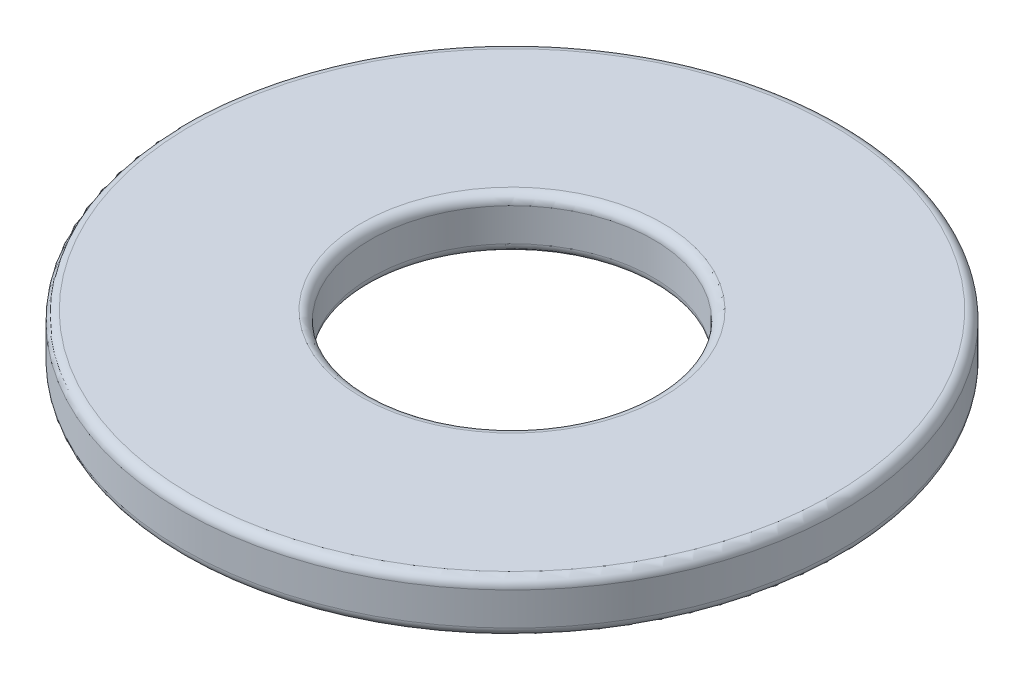
ISO-10303-21;
HEADER;
FILE_DESCRIPTION(('STEP AP214'),'2;1');
FILE_NAME('part.step','',(''),(''),'','','');
FILE_SCHEMA(('AUTOMOTIVE_DESIGN { 1 0 10303 214 1 1 1 1 }'));
ENDSEC;
DATA;
#1=APPLICATION_CONTEXT('core data for automotive mechanical design processes');
#2=APPLICATION_PROTOCOL_DEFINITION('international standard','automotive_design',2000,#1);
#3=PRODUCT_CONTEXT('',#1,'mechanical');
#4=PRODUCT('Part','Part','',(#3));
#5=PRODUCT_RELATED_PRODUCT_CATEGORY('part','',(#4));
#6=PRODUCT_DEFINITION_FORMATION('','',#4);
#7=PRODUCT_DEFINITION_CONTEXT('part definition',#1,'design');
#8=PRODUCT_DEFINITION('design','',#6,#7);
#9=PRODUCT_DEFINITION_SHAPE('','',#8);
#10=(LENGTH_UNIT() NAMED_UNIT(*) SI_UNIT(.MILLI.,.METRE.));
#11=(NAMED_UNIT(*) PLANE_ANGLE_UNIT() SI_UNIT($,.RADIAN.));
#12=(NAMED_UNIT(*) SI_UNIT($,.STERADIAN.) SOLID_ANGLE_UNIT());
#13=UNCERTAINTY_MEASURE_WITH_UNIT(LENGTH_MEASURE(1.E-05),#10,'distance_accuracy_value','');
#14=(GEOMETRIC_REPRESENTATION_CONTEXT(3) GLOBAL_UNCERTAINTY_ASSIGNED_CONTEXT((#13)) GLOBAL_UNIT_ASSIGNED_CONTEXT((#10,
#11,#12)) REPRESENTATION_CONTEXT('',''));
#15=CARTESIAN_POINT('',(0.,0.,0.));
#16=DIRECTION('',(0.,0.,1.));
#17=DIRECTION('',(1.,0.,0.));
#18=AXIS2_PLACEMENT_3D('',#15,#16,#17);
#19=CARTESIAN_POINT('',(0.,0.55,0.));
#20=DIRECTION('',(0.,1.,0.));
#21=DIRECTION('',(0.,0.,1.));
#22=AXIS2_PLACEMENT_3D('',#19,#20,#21);
#23=PLANE('',#22);
#24=CARTESIAN_POINT('',(0.,0.55,0.));
#25=DIRECTION('',(0.,1.,0.));
#26=DIRECTION('',(0.,0.,1.));
#27=AXIS2_PLACEMENT_3D('',#24,#25,#26);
#28=CIRCLE('',#27,1.6);
#29=CARTESIAN_POINT('',(0.,0.55,1.6));
#30=VERTEX_POINT('',#29);
#31=EDGE_CURVE('E50',#30,#30,#28,.F.);
#32=ORIENTED_EDGE('',*,*,#31,.T.);
#33=EDGE_LOOP('',(#32));
#34=FACE_BOUND('',#33,.T.);
#35=CARTESIAN_POINT('',(0.,0.55,0.));
#36=DIRECTION('',(0.,1.,0.));
#37=DIRECTION('',(0.,0.,1.));
#38=AXIS2_PLACEMENT_3D('',#35,#36,#37);
#39=CIRCLE('',#38,3.4);
#40=CARTESIAN_POINT('',(0.,0.55,3.4));
#41=VERTEX_POINT('',#40);
#42=EDGE_CURVE('E55',#41,#41,#39,.T.);
#43=ORIENTED_EDGE('',*,*,#42,.T.);
#44=EDGE_LOOP('',(#43));
#45=FACE_BOUND('',#44,.T.);
#46=ADVANCED_FACE('F37',(#34,#45),#23,.T.);
#47=CARTESIAN_POINT('',(0.,0.,0.));
#48=DIRECTION('',(0.,1.,0.));
#49=DIRECTION('',(0.,0.,1.));
#50=AXIS2_PLACEMENT_3D('',#47,#48,#49);
#51=PLANE('',#50);
#52=CARTESIAN_POINT('',(0.,0.,0.));
#53=DIRECTION('',(0.,1.,0.));
#54=DIRECTION('',(0.,0.,1.));
#55=AXIS2_PLACEMENT_3D('',#52,#53,#54);
#56=CIRCLE('',#55,1.6);
#57=CARTESIAN_POINT('',(0.,0.,1.6));
#58=VERTEX_POINT('',#57);
#59=EDGE_CURVE('E69',#58,#58,#56,.T.);
#60=ORIENTED_EDGE('',*,*,#59,.T.);
#61=EDGE_LOOP('',(#60));
#62=FACE_BOUND('',#61,.T.);
#63=CARTESIAN_POINT('',(0.,0.,0.));
#64=DIRECTION('',(0.,1.,0.));
#65=DIRECTION('',(0.,0.,1.));
#66=AXIS2_PLACEMENT_3D('',#63,#64,#65);
#67=CIRCLE('',#66,3.4);
#68=CARTESIAN_POINT('',(0.,0.,3.4));
#69=VERTEX_POINT('',#68);
#70=EDGE_CURVE('E73',#69,#69,#67,.F.);
#71=ORIENTED_EDGE('',*,*,#70,.T.);
#72=EDGE_LOOP('',(#71));
#73=FACE_BOUND('',#72,.T.);
#74=ADVANCED_FACE('F78',(#62,#73),#51,.F.);
#75=CARTESIAN_POINT('',(0.,0.55,0.));
#76=DIRECTION('',(0.,-1.,0.));
#77=DIRECTION('',(0.,0.,-1.));
#78=AXIS2_PLACEMENT_3D('',#75,#76,#77);
#79=CYLINDRICAL_SURFACE('',#78,3.5);
#80=CARTESIAN_POINT('',(0.,0.1,0.));
#81=DIRECTION('',(0.,1.,0.));
#82=DIRECTION('',(0.,0.,1.));
#83=AXIS2_PLACEMENT_3D('',#80,#81,#82);
#84=CIRCLE('',#83,3.5);
#85=CARTESIAN_POINT('',(0.,0.1,3.5));
#86=VERTEX_POINT('',#85);
#87=EDGE_CURVE('E10',#86,#86,#84,.T.);
#88=ORIENTED_EDGE('',*,*,#87,.T.);
#89=EDGE_LOOP('',(#88));
#90=FACE_BOUND('',#89,.T.);
#91=CARTESIAN_POINT('',(0.,0.45,0.));
#92=DIRECTION('',(0.,1.,0.));
#93=DIRECTION('',(0.,0.,1.));
#94=AXIS2_PLACEMENT_3D('',#91,#92,#93);
#95=CIRCLE('',#94,3.5);
#96=CARTESIAN_POINT('',(0.,0.45,3.5));
#97=VERTEX_POINT('',#96);
#98=EDGE_CURVE('E45',#97,#97,#95,.F.);
#99=ORIENTED_EDGE('',*,*,#98,.T.);
#100=EDGE_LOOP('',(#99));
#101=FACE_BOUND('',#100,.T.);
#102=ADVANCED_FACE('F98',(#90,#101),#79,.T.);
#103=CARTESIAN_POINT('',(0.,0.55,0.));
#104=DIRECTION('',(0.,-1.,0.));
#105=DIRECTION('',(0.,0.,-1.));
#106=AXIS2_PLACEMENT_3D('',#103,#104,#105);
#107=CYLINDRICAL_SURFACE('',#106,1.5);
#108=CARTESIAN_POINT('',(0.,0.1,0.));
#109=DIRECTION('',(0.,1.,0.));
#110=DIRECTION('',(0.,0.,1.));
#111=AXIS2_PLACEMENT_3D('',#108,#109,#110);
#112=CIRCLE('',#111,1.5);
#113=CARTESIAN_POINT('',(0.,0.1,1.5));
#114=VERTEX_POINT('',#113);
#115=EDGE_CURVE('E61',#114,#114,#112,.F.);
#116=ORIENTED_EDGE('',*,*,#115,.T.);
#117=EDGE_LOOP('',(#116));
#118=FACE_BOUND('',#117,.T.);
#119=CARTESIAN_POINT('',(0.,0.45,0.));
#120=DIRECTION('',(0.,1.,0.));
#121=DIRECTION('',(0.,0.,1.));
#122=AXIS2_PLACEMENT_3D('',#119,#120,#121);
#123=CIRCLE('',#122,1.5);
#124=CARTESIAN_POINT('',(0.,0.45,1.5));
#125=VERTEX_POINT('',#124);
#126=EDGE_CURVE('E65',#125,#125,#123,.T.);
#127=ORIENTED_EDGE('',*,*,#126,.T.);
#128=EDGE_LOOP('',(#127));
#129=FACE_BOUND('',#128,.T.);
#130=ADVANCED_FACE('F103',(#118,#129),#107,.F.);
#131=CARTESIAN_POINT('',(0.,0.1,0.));
#132=DIRECTION('',(0.,1.,0.));
#133=DIRECTION('',(0.,0.,1.));
#134=AXIS2_PLACEMENT_3D('',#131,#132,#133);
#135=TOROIDAL_SURFACE('',#134,1.6,0.1);
#136=ORIENTED_EDGE('',*,*,#115,.F.);
#137=EDGE_LOOP('',(#136));
#138=FACE_BOUND('',#137,.T.);
#139=ORIENTED_EDGE('',*,*,#59,.F.);
#140=EDGE_LOOP('',(#139));
#141=FACE_BOUND('',#140,.T.);
#142=ADVANCED_FACE('F89',(#138,#141),#135,.T.);
#143=CARTESIAN_POINT('',(0.,0.45,0.));
#144=DIRECTION('',(0.,1.,0.));
#145=DIRECTION('',(0.,0.,1.));
#146=AXIS2_PLACEMENT_3D('',#143,#144,#145);
#147=TOROIDAL_SURFACE('',#146,1.6,0.1);
#148=ORIENTED_EDGE('',*,*,#31,.F.);
#149=EDGE_LOOP('',(#148));
#150=FACE_BOUND('',#149,.T.);
#151=ORIENTED_EDGE('',*,*,#126,.F.);
#152=EDGE_LOOP('',(#151));
#153=FACE_BOUND('',#152,.T.);
#154=ADVANCED_FACE('F83',(#150,#153),#147,.T.);
#155=CARTESIAN_POINT('',(0.,0.1,0.));
#156=DIRECTION('',(0.,1.,0.));
#157=DIRECTION('',(0.,0.,1.));
#158=AXIS2_PLACEMENT_3D('',#155,#156,#157);
#159=TOROIDAL_SURFACE('',#158,3.4,0.1);
#160=ORIENTED_EDGE('',*,*,#70,.F.);
#161=EDGE_LOOP('',(#160));
#162=FACE_BOUND('',#161,.T.);
#163=ORIENTED_EDGE('',*,*,#87,.F.);
#164=EDGE_LOOP('',(#163));
#165=FACE_BOUND('',#164,.T.);
#166=ADVANCED_FACE('F80',(#162,#165),#159,.T.);
#167=CARTESIAN_POINT('',(0.,0.45,0.));
#168=DIRECTION('',(0.,1.,0.));
#169=DIRECTION('',(0.,0.,1.));
#170=AXIS2_PLACEMENT_3D('',#167,#168,#169);
#171=TOROIDAL_SURFACE('',#170,3.4,0.1);
#172=ORIENTED_EDGE('',*,*,#98,.F.);
#173=EDGE_LOOP('',(#172));
#174=FACE_BOUND('',#173,.T.);
#175=ORIENTED_EDGE('',*,*,#42,.F.);
#176=EDGE_LOOP('',(#175));
#177=FACE_BOUND('',#176,.T.);
#178=ADVANCED_FACE('F39',(#174,#177),#171,.T.);
#179=CLOSED_SHELL('',(#46,#74,#102,#130,#142,#154,#166,#178));
#180=MANIFOLD_SOLID_BREP('B2',#179);
#181=ADVANCED_BREP_SHAPE_REPRESENTATION('',(#18,#180),#14);
#182=SHAPE_DEFINITION_REPRESENTATION(#9,#181);
ENDSEC;
END-ISO-10303-21;
